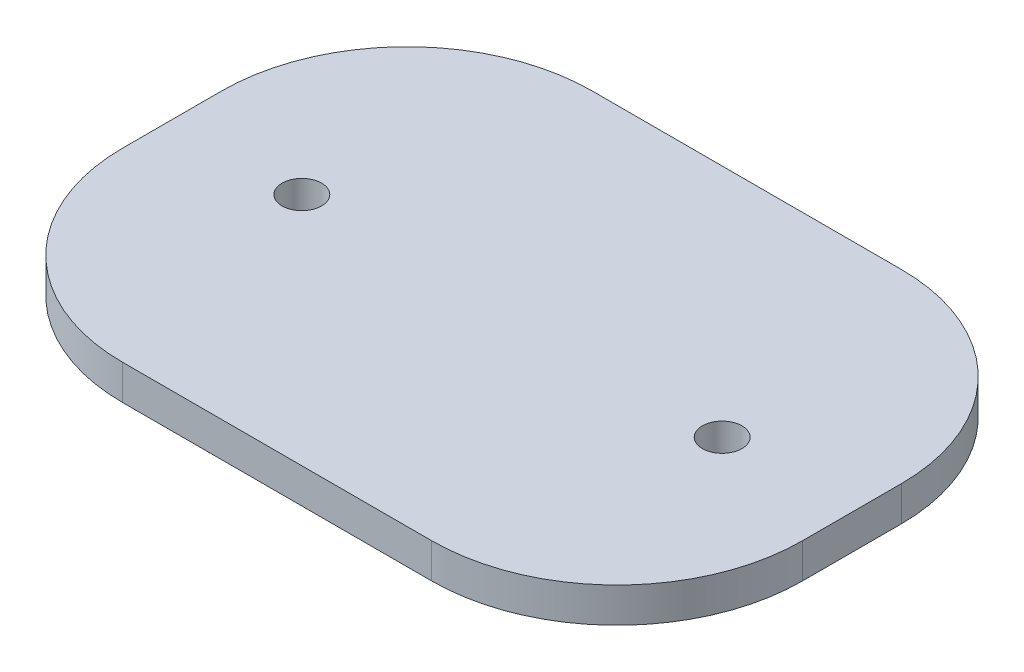
ISO-10303-21;
HEADER;
FILE_DESCRIPTION(('STEP AP214'),'2;1');
FILE_NAME('part.step','',(''),(''),'','','');
FILE_SCHEMA(('AUTOMOTIVE_DESIGN { 1 0 10303 214 1 1 1 1 }'));
ENDSEC;
DATA;
#1=APPLICATION_CONTEXT('core data for automotive mechanical design processes');
#2=APPLICATION_PROTOCOL_DEFINITION('international standard','automotive_design',2000,#1);
#3=PRODUCT_CONTEXT('',#1,'mechanical');
#4=PRODUCT('Part','Part','',(#3));
#5=PRODUCT_RELATED_PRODUCT_CATEGORY('part','',(#4));
#6=PRODUCT_DEFINITION_FORMATION('','',#4);
#7=PRODUCT_DEFINITION_CONTEXT('part definition',#1,'design');
#8=PRODUCT_DEFINITION('design','',#6,#7);
#9=PRODUCT_DEFINITION_SHAPE('','',#8);
#10=(LENGTH_UNIT() NAMED_UNIT(*) SI_UNIT(.MILLI.,.METRE.));
#11=(NAMED_UNIT(*) PLANE_ANGLE_UNIT() SI_UNIT($,.RADIAN.));
#12=(NAMED_UNIT(*) SI_UNIT($,.STERADIAN.) SOLID_ANGLE_UNIT());
#13=UNCERTAINTY_MEASURE_WITH_UNIT(LENGTH_MEASURE(1.E-05),#10,'distance_accuracy_value','');
#14=(GEOMETRIC_REPRESENTATION_CONTEXT(3) GLOBAL_UNCERTAINTY_ASSIGNED_CONTEXT((#13)) GLOBAL_UNIT_ASSIGNED_CONTEXT((#10,
#11,#12)) REPRESENTATION_CONTEXT('',''));
#15=CARTESIAN_POINT('',(0.,0.,0.));
#16=DIRECTION('',(0.,0.,1.));
#17=DIRECTION('',(1.,0.,0.));
#18=AXIS2_PLACEMENT_3D('',#15,#16,#17);
#19=CARTESIAN_POINT('',(-12.5,0.,3.99999999999999));
#20=DIRECTION('',(0.,1.,0.));
#21=DIRECTION('',(0.,0.,1.));
#22=AXIS2_PLACEMENT_3D('',#19,#20,#21);
#23=PLANE('',#22);
#24=CARTESIAN_POINT('',(-17.,0.,0.));
#25=DIRECTION('',(0.,1.,0.));
#26=DIRECTION('',(0.,0.,1.));
#27=AXIS2_PLACEMENT_3D('',#24,#25,#26);
#28=CIRCLE('',#27,1.6);
#29=CARTESIAN_POINT('',(-17.,0.,1.6));
#30=VERTEX_POINT('',#29);
#31=EDGE_CURVE('E353',#30,#30,#28,.T.);
#32=ORIENTED_EDGE('',*,*,#31,.T.);
#33=EDGE_LOOP('',(#32));
#34=FACE_BOUND('',#33,.T.);
#35=CARTESIAN_POINT('',(17.,0.,0.));
#36=DIRECTION('',(0.,1.,0.));
#37=DIRECTION('',(0.,0.,1.));
#38=AXIS2_PLACEMENT_3D('',#35,#36,#37);
#39=CIRCLE('',#38,1.6);
#40=CARTESIAN_POINT('',(17.,0.,1.6));
#41=VERTEX_POINT('',#40);
#42=EDGE_CURVE('E871',#41,#41,#39,.T.);
#43=ORIENTED_EDGE('',*,*,#42,.T.);
#44=EDGE_LOOP('',(#43));
#45=FACE_BOUND('',#44,.T.);
#46=CARTESIAN_POINT('',(-12.5,0.,3.99999999999999));
#47=DIRECTION('',(0.,1.,0.));
#48=DIRECTION('',(0.,0.,1.));
#49=AXIS2_PLACEMENT_3D('',#46,#47,#48);
#50=CIRCLE('',#49,10.);
#51=CARTESIAN_POINT('',(-22.5,0.,3.99999999999992));
#52=VERTEX_POINT('',#51);
#53=CARTESIAN_POINT('',(-12.4999999999999,0.,14.));
#54=VERTEX_POINT('',#53);
#55=EDGE_CURVE('E358',#52,#54,#50,.T.);
#56=ORIENTED_EDGE('',*,*,#55,.F.);
#57=DIRECTION('',(0.,0.,1.));
#58=VECTOR('',#57,1.);
#59=CARTESIAN_POINT('',(-22.5,0.,3.99999999999992));
#60=LINE('',#59,#58);
#61=CARTESIAN_POINT('',(-22.5,0.,-3.99999999999993));
#62=VERTEX_POINT('',#61);
#63=EDGE_CURVE('E471',#62,#52,#60,.T.);
#64=ORIENTED_EDGE('',*,*,#63,.F.);
#65=CARTESIAN_POINT('',(-12.5,0.,-4.00000000000001));
#66=DIRECTION('',(0.,1.,0.));
#67=DIRECTION('',(0.,0.,-1.));
#68=AXIS2_PLACEMENT_3D('',#65,#66,#67);
#69=CIRCLE('',#68,10.);
#70=CARTESIAN_POINT('',(-12.5,0.,-14.));
#71=VERTEX_POINT('',#70);
#72=EDGE_CURVE('E545',#71,#62,#69,.T.);
#73=ORIENTED_EDGE('',*,*,#72,.F.);
#74=DIRECTION('',(-1.,0.,0.));
#75=VECTOR('',#74,1.);
#76=CARTESIAN_POINT('',(-12.4999999999999,0.,-14.));
#77=LINE('',#76,#75);
#78=CARTESIAN_POINT('',(12.4999999999999,0.,-14.));
#79=VERTEX_POINT('',#78);
#80=EDGE_CURVE('E535',#79,#71,#77,.T.);
#81=ORIENTED_EDGE('',*,*,#80,.F.);
#82=CARTESIAN_POINT('',(12.5,0.,-4.));
#83=DIRECTION('',(0.,1.,0.));
#84=DIRECTION('',(0.,0.,1.));
#85=AXIS2_PLACEMENT_3D('',#82,#83,#84);
#86=CIRCLE('',#85,10.);
#87=CARTESIAN_POINT('',(22.5,0.,-3.99999999999993));
#88=VERTEX_POINT('',#87);
#89=EDGE_CURVE('E525',#88,#79,#86,.T.);
#90=ORIENTED_EDGE('',*,*,#89,.F.);
#91=DIRECTION('',(0.,0.,-1.));
#92=VECTOR('',#91,1.);
#93=CARTESIAN_POINT('',(22.5,0.,3.99999999999993));
#94=LINE('',#93,#92);
#95=CARTESIAN_POINT('',(22.5,0.,3.99999999999993));
#96=VERTEX_POINT('',#95);
#97=EDGE_CURVE('E514',#96,#88,#94,.T.);
#98=ORIENTED_EDGE('',*,*,#97,.F.);
#99=CARTESIAN_POINT('',(12.5,0.,4.));
#100=DIRECTION('',(0.,1.,0.));
#101=DIRECTION('',(0.,0.,1.));
#102=AXIS2_PLACEMENT_3D('',#99,#100,#101);
#103=CIRCLE('',#102,10.);
#104=CARTESIAN_POINT('',(12.4999999999999,0.,14.));
#105=VERTEX_POINT('',#104);
#106=EDGE_CURVE('E503',#105,#96,#103,.T.);
#107=ORIENTED_EDGE('',*,*,#106,.F.);
#108=DIRECTION('',(1.,0.,0.));
#109=VECTOR('',#108,1.);
#110=CARTESIAN_POINT('',(-12.4999999999999,0.,14.));
#111=LINE('',#110,#109);
#112=EDGE_CURVE('E363',#54,#105,#111,.T.);
#113=ORIENTED_EDGE('',*,*,#112,.F.);
#114=EDGE_LOOP('',(#56,#64,#73,#81,#90,#98,#107,#113));
#115=FACE_BOUND('',#114,.T.);
#116=ADVANCED_FACE('F237',(#34,#45,#115),#23,.F.);
#117=CARTESIAN_POINT('',(-22.5,0.,-3.99999999793787));
#118=CARTESIAN_POINT('',(-27.5,2.,-3.99999999725475));
#119=CARTESIAN_POINT('',(-22.5,0.,-3.41909728808261));
#120=CARTESIAN_POINT('',(-27.5,2.,-3.22665565237734));
#121=CARTESIAN_POINT('',(-22.5,0.,-2.15693573160333));
#122=CARTESIAN_POINT('',(-27.5,2.,-1.87246851236455));
#123=CARTESIAN_POINT('',(-22.4999999999999,0.,0.));
#124=CARTESIAN_POINT('',(-27.5,2.,0.));
#125=CARTESIAN_POINT('',(-22.5,0.,2.15693573160332));
#126=CARTESIAN_POINT('',(-27.5,2.,1.87246851236454));
#127=CARTESIAN_POINT('',(-22.5,0.,3.4190972880826));
#128=CARTESIAN_POINT('',(-27.5,2.,3.22665565237733));
#129=CARTESIAN_POINT('',(-22.5,0.,4.69738044233488));
#130=CARTESIAN_POINT('',(-27.5,2.,4.92840885772796));
#131=CARTESIAN_POINT('',(-22.355458001131,0.,6.04561976731065));
#132=CARTESIAN_POINT('',(-27.3268396071023,2.,6.83441065921755));
#133=CARTESIAN_POINT('',(-21.7714475420713,0.,7.90598431127842));
#134=CARTESIAN_POINT('',(-26.4822916202665,2.,9.70767416265126));
#135=CARTESIAN_POINT('',(-20.8697424565421,0.,9.58070064986567));
#136=CARTESIAN_POINT('',(-25.0379001290509,2.,12.4263165851559));
#137=CARTESIAN_POINT('',(-19.6805517905211,0.,11.043252891795));
#138=CARTESIAN_POINT('',(-23.0476740072102,2.,14.8143366522482));
#139=CARTESIAN_POINT('',(-18.2340845899858,0.,12.2671251457889));
#140=CARTESIAN_POINT('',(-20.633040050982,2.,16.7254698605989));
#141=CARTESIAN_POINT('',(-16.5491619591087,0.,13.2124423093309));
#142=CARTESIAN_POINT('',(-17.9575512875605,2.,18.0743935723073));
#143=CARTESIAN_POINT('',(-14.6446050020623,0.,13.8393292799044));
#144=CARTESIAN_POINT('',(-15.1897519287645,2.,18.8450121601466));
#145=CARTESIAN_POINT('',(-13.2369733492119,0.,14.));
#146=CARTESIAN_POINT('',(-13.3791611347157,2.,19.));
#147=CARTESIAN_POINT('',(-10.5816164356851,0.,14.));
#148=CARTESIAN_POINT('',(-10.2114935390452,2.,19.));
#149=CARTESIAN_POINT('',(-6.52902380407733,0.,14.));
#150=CARTESIAN_POINT('',(-5.98292490141734,2.,19.));
#151=CARTESIAN_POINT('',(0.,0.,14.));
#152=CARTESIAN_POINT('',(0.,2.,19.));
#153=CARTESIAN_POINT('',(6.52902380407733,0.,14.));
#154=CARTESIAN_POINT('',(5.98292490141724,2.,19.));
#155=CARTESIAN_POINT('',(10.5816164356851,0.,14.));
#156=CARTESIAN_POINT('',(10.2114935390451,2.,19.));
#157=CARTESIAN_POINT('',(13.2369733492118,0.,14.));
#158=CARTESIAN_POINT('',(13.3791611347156,2.,19.));
#159=CARTESIAN_POINT('',(14.6446050020622,0.,13.8393292799044));
#160=CARTESIAN_POINT('',(15.1897519287644,2.,18.8450121601466));
#161=CARTESIAN_POINT('',(16.5491619591087,0.,13.2124423093309));
#162=CARTESIAN_POINT('',(17.9575512875605,2.,18.0743935723074));
#163=CARTESIAN_POINT('',(18.2340845899858,0.,12.2671251457889));
#164=CARTESIAN_POINT('',(20.6330400509819,2.,16.7254698605988));
#165=CARTESIAN_POINT('',(19.6805517905211,0.,11.043252891795));
#166=CARTESIAN_POINT('',(23.0476740072102,2.,14.8143366522483));
#167=CARTESIAN_POINT('',(20.8697424565421,0.,9.58070064986569));
#168=CARTESIAN_POINT('',(25.0379001290509,2.,12.426316585156));
#169=CARTESIAN_POINT('',(21.7714475420713,0.,7.90598431127844));
#170=CARTESIAN_POINT('',(26.4822916202664,2.,9.70767416265135));
#171=CARTESIAN_POINT('',(22.355458001131,0.,6.04561976731066));
#172=CARTESIAN_POINT('',(27.3268396071023,2.,6.83441065921764));
#173=CARTESIAN_POINT('',(22.5,0.,4.69738044233489));
#174=CARTESIAN_POINT('',(27.5,2.,4.92840885772804));
#175=CARTESIAN_POINT('',(22.5,0.,3.41909728808261));
#176=CARTESIAN_POINT('',(27.5,2.,3.2266556523774));
#177=CARTESIAN_POINT('',(22.5,0.,2.15693573160332));
#178=CARTESIAN_POINT('',(27.5,2.,1.87246851236459));
#179=CARTESIAN_POINT('',(22.5,0.,0.));
#180=CARTESIAN_POINT('',(27.5,2.,0.));
#181=CARTESIAN_POINT('',(22.5,0.,-2.15693573160333));
#182=CARTESIAN_POINT('',(27.5,2.,-1.87246851236453));
#183=CARTESIAN_POINT('',(22.5,0.,-3.41909728808261));
#184=CARTESIAN_POINT('',(27.5,2.,-3.22665565237733));
#185=CARTESIAN_POINT('',(22.5,0.,-4.69738044233489));
#186=CARTESIAN_POINT('',(27.5,2.,-4.92840885772798));
#187=CARTESIAN_POINT('',(22.355458001131,0.,-6.04561976731069));
#188=CARTESIAN_POINT('',(27.3268396071023,2.,-6.83441065921757));
#189=CARTESIAN_POINT('',(21.7714475420713,0.,-7.90598431127842));
#190=CARTESIAN_POINT('',(26.4822916202664,2.,-9.70767416265131));
#191=CARTESIAN_POINT('',(20.8697424565421,0.,-9.58070064986569));
#192=CARTESIAN_POINT('',(25.037900129051,2.00000000000001,-12.426316585156));
#193=CARTESIAN_POINT('',(19.6805517905211,0.,-11.043252891795));
#194=CARTESIAN_POINT('',(23.0476740072101,1.99999999999999,-14.8143366522482));
#195=CARTESIAN_POINT('',(18.2340845899858,0.,-12.2671251457889));
#196=CARTESIAN_POINT('',(20.633040050982,2.,-16.7254698605989));
#197=CARTESIAN_POINT('',(16.5491619591087,0.,-13.2124423093309));
#198=CARTESIAN_POINT('',(17.9575512875604,2.,-18.0743935723074));
#199=CARTESIAN_POINT('',(14.6446050020623,0.,-13.8393292799045));
#200=CARTESIAN_POINT('',(15.1897519287644,2.,-18.8450121601466));
#201=CARTESIAN_POINT('',(13.2369733492119,0.,-14.));
#202=CARTESIAN_POINT('',(13.3791611347156,2.,-19.));
#203=CARTESIAN_POINT('',(10.5816164356851,0.,-14.));
#204=CARTESIAN_POINT('',(10.2114935390451,2.,-19.));
#205=CARTESIAN_POINT('',(6.52902380407732,0.,-14.));
#206=CARTESIAN_POINT('',(5.98292490141725,2.,-19.));
#207=CARTESIAN_POINT('',(0.,0.,-14.));
#208=CARTESIAN_POINT('',(0.,2.,-19.));
#209=CARTESIAN_POINT('',(-6.52902380407739,0.,-14.));
#210=CARTESIAN_POINT('',(-5.98292490141727,2.,-19.));
#211=CARTESIAN_POINT('',(-10.5816164356852,0.,-14.));
#212=CARTESIAN_POINT('',(-10.2114935390451,2.,-19.));
#213=CARTESIAN_POINT('',(-13.2369733492119,0.,-14.));
#214=CARTESIAN_POINT('',(-13.3791611347156,2.,-19.));
#215=CARTESIAN_POINT('',(-14.6446050020623,0.,-13.8393292799044));
#216=CARTESIAN_POINT('',(-15.1897519287644,2.,-18.8450121601467));
#217=CARTESIAN_POINT('',(-16.5491619591087,0.,-13.2124423093309));
#218=CARTESIAN_POINT('',(-17.9575512875605,2.,-18.0743935723074));
#219=CARTESIAN_POINT('',(-18.2340845899858,0.,-12.2671251457889));
#220=CARTESIAN_POINT('',(-20.6330400509819,2.,-16.7254698605989));
#221=CARTESIAN_POINT('',(-19.6805517905211,0.,-11.043252891795));
#222=CARTESIAN_POINT('',(-23.0476740072103,1.99999999999999,-14.8143366522483));
#223=CARTESIAN_POINT('',(-20.8697424565421,0.,-9.58070064986569));
#224=CARTESIAN_POINT('',(-25.0379001290509,2.00000000000001,-12.426316585156));
#225=CARTESIAN_POINT('',(-21.7714475420713,0.,-7.90598431127844));
#226=CARTESIAN_POINT('',(-26.4822916202665,1.99999999999999,-9.70767416265128));
#227=CARTESIAN_POINT('',(-22.355458001131,0.,-6.04561976731064));
#228=CARTESIAN_POINT('',(-27.3268396071023,2.00000000000001,-6.83441065921759));
#229=CARTESIAN_POINT('',(-22.5,0.,-4.69738044233489));
#230=CARTESIAN_POINT('',(-27.5,2.,-4.92840885772798));
#231=CARTESIAN_POINT('',(-22.5,0.,-3.99999999793787));
#232=CARTESIAN_POINT('',(-27.5,2.,-3.99999999725475));
#233=B_SPLINE_SURFACE_WITH_KNOTS('',3,1,((#117,#118),(#119,#120),(#121,#122),(#123,#124),(#125,
#126),(#127,#128),(#129,#130),(#131,#132),(#133,#134),(#135,#136),(#137,#138),(#139,#140),(#141,
#142),(#143,#144),(#145,#146),(#147,#148),(#149,#150),(#151,#152),(#153,#154),(#155,#156),(#157,
#158),(#159,#160),(#161,#162),(#163,#164),(#165,#166),(#167,#168),(#169,#170),(#171,#172),(#173,
#174),(#175,#176),(#177,#178),(#179,#180),(#181,#182),(#183,#184),(#185,#186),(#187,#188),(#189,
#190),(#191,#192),(#193,#194),(#195,#196),(#197,#198),(#199,#200),(#201,#202),(#203,#204),(#205,
#206),(#207,#208),(#209,#210),(#211,#212),(#213,#214),(#215,#216),(#217,#218),(#219,#220),(#221,
#222),(#223,#224),(#225,#226),(#227,#228),(#229,#230),(#231,#232)),.UNSPECIFIED.,.T.,.F.,.F.,(4,
1,1,1,2,1,1,1,1,1,1,1,2,1,1,1,2,1,1,1,1,1,1,1,2,1,1,1,2,1,1,1,1,1,1,1,2,1,1,1,2,1,1,1,1,1,1,1,
4),(2,2),(0.,0.0140023916236612,0.0280047832473224,0.0420071748709836,0.0560095664946448,
0.072819600132744,0.0896296337708432,0.106439667408942,0.123249701047042,0.140059734685141,
0.15686976832324,0.173679801961339,0.190489835599438,0.23424730942338,0.278004783247322,
0.321762257071264,0.365519730895206,0.382329764533305,0.399139798171404,0.415949831809504,
0.432759865447603,0.449569899085702,0.466379932723801,0.4831899663619,0.5,0.514002391623661,
0.528004783247322,0.542007174870983,0.556009566494645,0.572819600132744,0.589629633770843,
0.606439667408942,0.623249701047042,0.640059734685141,0.65686976832324,0.673679801961339,
0.690489835599439,0.734247309423381,0.778004783247322,0.821762257071264,0.865519730895206,
0.882329764533305,0.899139798171405,0.915949831809504,0.932759865447603,0.949569899085702,
0.966379932723802,0.983189966361901,1.),(0.,1.),.UNSPECIFIED.);
#234=CARTESIAN_POINT('',(12.5,2.,-4.));
#235=DIRECTION('',(0.,1.,0.));
#236=DIRECTION('',(0.,0.,1.));
#237=AXIS2_PLACEMENT_3D('',#234,#235,#236);
#238=CIRCLE('',#237,15.);
#239=CARTESIAN_POINT('',(27.5,2.,-4.00000000001576));
#240=VERTEX_POINT('',#239);
#241=CARTESIAN_POINT('',(12.4999999999999,2.,-19.));
#242=VERTEX_POINT('',#241);
#243=EDGE_CURVE('E251',#240,#242,#238,.T.);
#244=DIRECTION('',(0.,0.,-1.));
#245=VECTOR('',#244,1.);
#246=CARTESIAN_POINT('',(27.5,2.,4.));
#247=LINE('',#246,#245);
#248=CARTESIAN_POINT('',(27.5,2.,3.99999999972068));
#249=VERTEX_POINT('',#248);
#250=EDGE_CURVE('E612',#249,#240,#247,.T.);
#251=CARTESIAN_POINT('',(12.5,2.,4.));
#252=DIRECTION('',(0.,1.,0.));
#253=DIRECTION('',(0.,0.,1.));
#254=AXIS2_PLACEMENT_3D('',#251,#252,#253);
#255=CIRCLE('',#254,15.);
#256=CARTESIAN_POINT('',(12.5000000000691,2.,19.));
#257=VERTEX_POINT('',#256);
#258=EDGE_CURVE('E602',#257,#249,#255,.T.);
#259=DIRECTION('',(1.,0.,0.));
#260=VECTOR('',#259,1.);
#261=CARTESIAN_POINT('',(-12.4999999999999,2.,19.));
#262=LINE('',#261,#260);
#263=CARTESIAN_POINT('',(-12.5000000000478,2.,19.));
#264=VERTEX_POINT('',#263);
#265=EDGE_CURVE('E591',#264,#257,#262,.T.);
#266=CARTESIAN_POINT('',(-12.5,2.,3.99999999999999));
#267=DIRECTION('',(0.,1.,0.));
#268=DIRECTION('',(0.,0.,1.));
#269=AXIS2_PLACEMENT_3D('',#266,#267,#268);
#270=CIRCLE('',#269,15.);
#271=CARTESIAN_POINT('',(-27.5,2.,4.00000000001585));
#272=VERTEX_POINT('',#271);
#273=EDGE_CURVE('E377',#272,#264,#270,.T.);
#274=DIRECTION('',(0.,0.,1.));
#275=VECTOR('',#274,1.);
#276=CARTESIAN_POINT('',(-27.5,2.,-3.99999999999993));
#277=LINE('',#276,#275);
#278=CARTESIAN_POINT('',(-27.5,2.,-3.99999999972044));
#279=VERTEX_POINT('',#278);
#280=EDGE_CURVE('E405',#279,#272,#277,.T.);
#281=CARTESIAN_POINT('',(-12.5,2.,-4.00000000000001));
#282=DIRECTION('',(0.,1.,0.));
#283=DIRECTION('',(0.,0.,1.));
#284=AXIS2_PLACEMENT_3D('',#281,#282,#283);
#285=CIRCLE('',#284,15.);
#286=CARTESIAN_POINT('',(-12.4999999999999,2.,-19.));
#287=VERTEX_POINT('',#286);
#288=EDGE_CURVE('E244',#287,#279,#285,.T.);
#289=DIRECTION('',(-1.,0.,0.));
#290=VECTOR('',#289,1.);
#291=CARTESIAN_POINT('',(12.4999999999999,2.,-19.));
#292=LINE('',#291,#290);
#293=EDGE_CURVE('E12',#242,#287,#292,.T.);
#294=CARTESIAN_POINT('',(0.,0.,-14.));
#295=CARTESIAN_POINT('',(0.,2.,-19.));
#296=CARTESIAN_POINT('',(-2.17634126802581,0.,-14.));
#297=CARTESIAN_POINT('',(-1.99430830047243,2.,-19.));
#298=CARTESIAN_POINT('',(-6.52902380407739,0.,-14.));
#299=CARTESIAN_POINT('',(-5.98292490141727,2.,-19.));
#300=CARTESIAN_POINT('',(-10.5816164356852,0.,-14.));
#301=CARTESIAN_POINT('',(-10.2114935390451,2.,-19.));
#302=CARTESIAN_POINT('',(-13.2369733492119,0.,-14.));
#303=CARTESIAN_POINT('',(-13.3791611347156,2.,-19.));
#304=CARTESIAN_POINT('',(-14.6446050020623,0.,-13.8393292799044));
#305=CARTESIAN_POINT('',(-15.1897519287644,2.,-18.8450121601467));
#306=CARTESIAN_POINT('',(-16.5491619591087,0.,-13.2124423093309));
#307=CARTESIAN_POINT('',(-17.9575512875605,2.,-18.0743935723074));
#308=CARTESIAN_POINT('',(-18.2340845899858,0.,-12.2671251457889));
#309=CARTESIAN_POINT('',(-20.6330400509819,2.,-16.7254698605989));
#310=CARTESIAN_POINT('',(-19.6805517905211,0.,-11.043252891795));
#311=CARTESIAN_POINT('',(-23.0476740072103,1.99999999999999,-14.8143366522483));
#312=CARTESIAN_POINT('',(-20.8697424565421,0.,-9.58070064986569));
#313=CARTESIAN_POINT('',(-25.0379001290509,2.00000000000001,-12.426316585156));
#314=CARTESIAN_POINT('',(-21.7714475420713,0.,-7.90598431127844));
#315=CARTESIAN_POINT('',(-26.4822916202665,1.99999999999999,-9.70767416265128));
#316=CARTESIAN_POINT('',(-22.355458001131,0.,-6.04561976731064));
#317=CARTESIAN_POINT('',(-27.3268396071023,2.00000000000001,-6.83441065921759));
#318=CARTESIAN_POINT('',(-22.5,0.,-4.69738044233489));
#319=CARTESIAN_POINT('',(-27.5,2.,-4.92840885772798));
#320=CARTESIAN_POINT('',(-22.5,0.,-3.41909728808261));
#321=CARTESIAN_POINT('',(-27.5,2.,-3.22665565237734));
#322=CARTESIAN_POINT('',(-22.5,0.,-2.15693573160333));
#323=CARTESIAN_POINT('',(-27.5,2.,-1.87246851236455));
#324=CARTESIAN_POINT('',(-22.4999999999999,0.,0.));
#325=CARTESIAN_POINT('',(-27.5,2.,0.));
#326=CARTESIAN_POINT('',(-22.5,0.,2.15693573160332));
#327=CARTESIAN_POINT('',(-27.5,2.,1.87246851236454));
#328=CARTESIAN_POINT('',(-22.5,0.,3.4190972880826));
#329=CARTESIAN_POINT('',(-27.5,2.,3.22665565237733));
#330=CARTESIAN_POINT('',(-22.5,0.,4.69738044233488));
#331=CARTESIAN_POINT('',(-27.5,2.,4.92840885772796));
#332=CARTESIAN_POINT('',(-22.355458001131,0.,6.04561976731065));
#333=CARTESIAN_POINT('',(-27.3268396071023,2.,6.83441065921755));
#334=CARTESIAN_POINT('',(-21.7714475420713,0.,7.90598431127842));
#335=CARTESIAN_POINT('',(-26.4822916202665,2.,9.70767416265126));
#336=CARTESIAN_POINT('',(-20.8697424565421,0.,9.58070064986567));
#337=CARTESIAN_POINT('',(-25.0379001290509,2.,12.4263165851559));
#338=CARTESIAN_POINT('',(-19.6805517905211,0.,11.043252891795));
#339=CARTESIAN_POINT('',(-23.0476740072102,2.,14.8143366522482));
#340=CARTESIAN_POINT('',(-18.2340845899858,0.,12.2671251457889));
#341=CARTESIAN_POINT('',(-20.633040050982,2.,16.7254698605989));
#342=CARTESIAN_POINT('',(-16.5491619591087,0.,13.2124423093309));
#343=CARTESIAN_POINT('',(-17.9575512875605,2.,18.0743935723073));
#344=CARTESIAN_POINT('',(-14.6446050020623,0.,13.8393292799044));
#345=CARTESIAN_POINT('',(-15.1897519287645,2.,18.8450121601466));
#346=CARTESIAN_POINT('',(-13.2369733492119,0.,14.));
#347=CARTESIAN_POINT('',(-13.3791611347157,2.,19.));
#348=CARTESIAN_POINT('',(-10.5816164356851,0.,14.));
#349=CARTESIAN_POINT('',(-10.2114935390452,2.,19.));
#350=CARTESIAN_POINT('',(-6.52902380407733,0.,14.));
#351=CARTESIAN_POINT('',(-5.98292490141734,2.,19.));
#352=CARTESIAN_POINT('',(0.,0.,14.));
#353=CARTESIAN_POINT('',(0.,2.,19.));
#354=CARTESIAN_POINT('',(6.52902380407733,0.,14.));
#355=CARTESIAN_POINT('',(5.98292490141724,2.,19.));
#356=CARTESIAN_POINT('',(10.5816164356851,0.,14.));
#357=CARTESIAN_POINT('',(10.2114935390451,2.,19.));
#358=CARTESIAN_POINT('',(13.2369733492118,0.,14.));
#359=CARTESIAN_POINT('',(13.3791611347156,2.,19.));
#360=CARTESIAN_POINT('',(14.6446050020622,0.,13.8393292799044));
#361=CARTESIAN_POINT('',(15.1897519287644,2.,18.8450121601466));
#362=CARTESIAN_POINT('',(16.5491619591087,0.,13.2124423093309));
#363=CARTESIAN_POINT('',(17.9575512875605,2.,18.0743935723074));
#364=CARTESIAN_POINT('',(18.2340845899858,0.,12.2671251457889));
#365=CARTESIAN_POINT('',(20.6330400509819,2.,16.7254698605988));
#366=CARTESIAN_POINT('',(19.6805517905211,0.,11.043252891795));
#367=CARTESIAN_POINT('',(23.0476740072102,2.,14.8143366522483));
#368=CARTESIAN_POINT('',(20.8697424565421,0.,9.58070064986569));
#369=CARTESIAN_POINT('',(25.0379001290509,2.,12.426316585156));
#370=CARTESIAN_POINT('',(21.7714475420713,0.,7.90598431127844));
#371=CARTESIAN_POINT('',(26.4822916202664,2.,9.70767416265135));
#372=CARTESIAN_POINT('',(22.355458001131,0.,6.04561976731066));
#373=CARTESIAN_POINT('',(27.3268396071023,2.,6.83441065921764));
#374=CARTESIAN_POINT('',(22.5,0.,4.69738044233489));
#375=CARTESIAN_POINT('',(27.5,2.,4.92840885772804));
#376=CARTESIAN_POINT('',(22.5,0.,3.41909728808261));
#377=CARTESIAN_POINT('',(27.5,2.,3.2266556523774));
#378=CARTESIAN_POINT('',(22.5,0.,2.15693573160332));
#379=CARTESIAN_POINT('',(27.5,2.,1.87246851236459));
#380=CARTESIAN_POINT('',(22.5,0.,0.));
#381=CARTESIAN_POINT('',(27.5,2.,0.));
#382=CARTESIAN_POINT('',(22.5,0.,-2.15693573160333));
#383=CARTESIAN_POINT('',(27.5,2.,-1.87246851236453));
#384=CARTESIAN_POINT('',(22.5,0.,-3.41909728808261));
#385=CARTESIAN_POINT('',(27.5,2.,-3.22665565237733));
#386=CARTESIAN_POINT('',(22.5,0.,-4.69738044233489));
#387=CARTESIAN_POINT('',(27.5,2.,-4.92840885772798));
#388=CARTESIAN_POINT('',(22.355458001131,0.,-6.04561976731069));
#389=CARTESIAN_POINT('',(27.3268396071023,2.,-6.83441065921757));
#390=CARTESIAN_POINT('',(21.7714475420713,0.,-7.90598431127842));
#391=CARTESIAN_POINT('',(26.4822916202664,2.,-9.70767416265131));
#392=CARTESIAN_POINT('',(20.8697424565421,0.,-9.58070064986569));
#393=CARTESIAN_POINT('',(25.037900129051,2.00000000000001,-12.426316585156));
#394=CARTESIAN_POINT('',(19.6805517905211,0.,-11.043252891795));
#395=CARTESIAN_POINT('',(23.0476740072101,1.99999999999999,-14.8143366522482));
#396=CARTESIAN_POINT('',(18.2340845899858,0.,-12.2671251457889));
#397=CARTESIAN_POINT('',(20.633040050982,2.,-16.7254698605989));
#398=CARTESIAN_POINT('',(16.5491619591087,0.,-13.2124423093309));
#399=CARTESIAN_POINT('',(17.9575512875604,2.,-18.0743935723074));
#400=CARTESIAN_POINT('',(14.6446050020623,0.,-13.8393292799045));
#401=CARTESIAN_POINT('',(15.1897519287644,2.,-18.8450121601466));
#402=CARTESIAN_POINT('',(13.2369733492119,0.,-14.));
#403=CARTESIAN_POINT('',(13.3791611347156,2.,-19.));
#404=CARTESIAN_POINT('',(10.5816164356851,0.,-14.));
#405=CARTESIAN_POINT('',(10.2114935390451,2.,-19.));
#406=CARTESIAN_POINT('',(6.52902380407732,0.,-14.));
#407=CARTESIAN_POINT('',(5.98292490141725,2.,-19.));
#408=CARTESIAN_POINT('',(2.17634126802575,0.,-14.));
#409=CARTESIAN_POINT('',(1.99430830047241,2.,-19.));
#410=CARTESIAN_POINT('',(0.,0.,-14.));
#411=CARTESIAN_POINT('',(0.,2.,-19.));
#412=B_SPLINE_SURFACE_WITH_KNOTS('',3,1,((#294,#295),(#296,#297),(#298,#299),(#300,#301),(#302,
#303),(#304,#305),(#306,#307),(#308,#309),(#310,#311),(#312,#313),(#314,#315),(#316,#317),(#318,
#319),(#320,#321),(#322,#323),(#324,#325),(#326,#327),(#328,#329),(#330,#331),(#332,#333),(#334,
#335),(#336,#337),(#338,#339),(#340,#341),(#342,#343),(#344,#345),(#346,#347),(#348,#349),(#350,
#351),(#352,#353),(#354,#355),(#356,#357),(#358,#359),(#360,#361),(#362,#363),(#364,#365),(#366,
#367),(#368,#369),(#370,#371),(#372,#373),(#374,#375),(#376,#377),(#378,#379),(#380,#381),(#382,
#383),(#384,#385),(#386,#387),(#388,#389),(#390,#391),(#392,#393),(#394,#395),(#396,#397),(#398,
#399),(#400,#401),(#402,#403),(#404,#405),(#406,#407),(#408,#409),(#410,#411)),.UNSPECIFIED.,
.T.,.F.,.F.,(4,1,2,1,1,1,1,1,1,1,2,1,1,1,2,1,1,1,1,1,1,1,2,1,1,1,2,1,1,1,1,1,1,1,2,1,1,1,2,1,1,
1,1,1,1,1,2,1,4),(2,2),(0.778004783247322,0.821762257071264,0.865519730895206,0.882329764533305,
0.899139798171405,0.915949831809504,0.932759865447603,0.949569899085702,0.966379932723802,
0.983189966361901,1.,1.01400239162366,1.02800478324732,1.04200717487098,1.05600956649464,
1.07281960013274,1.08962963377084,1.10643966740894,1.12324970104704,1.14005973468514,
1.15686976832324,1.17367980196134,1.19048983559944,1.23424730942338,1.27800478324732,
1.32176225707126,1.36551973089521,1.38232976453331,1.3991397981714,1.4159498318095,
1.4327598654476,1.4495698990857,1.4663799327238,1.4831899663619,1.5,1.51400239162366,
1.52800478324732,1.54200717487098,1.55600956649464,1.57281960013274,1.58962963377084,
1.60643966740894,1.62324970104704,1.64005973468514,1.65686976832324,1.67367980196134,
1.69048983559944,1.73424730942338,1.77800478324732),(0.,1.),.UNSPECIFIED.);
#413=ORIENTED_EDGE('',*,*,#63,.T.);
#414=ORIENTED_EDGE('',*,*,#55,.T.);
#415=ORIENTED_EDGE('',*,*,#112,.T.);
#416=ORIENTED_EDGE('',*,*,#106,.T.);
#417=ORIENTED_EDGE('',*,*,#97,.T.);
#418=ORIENTED_EDGE('',*,*,#89,.T.);
#419=ORIENTED_EDGE('',*,*,#80,.T.);
#420=ORIENTED_EDGE('',*,*,#72,.T.);
#421=EDGE_LOOP('',(#413,#414,#415,#416,#417,#418,#419,#420));
#422=FACE_BOUND('',#421,.T.);
#423=ORIENTED_EDGE('',*,*,#243,.F.);
#424=ORIENTED_EDGE('',*,*,#250,.F.);
#425=ORIENTED_EDGE('',*,*,#258,.F.);
#426=ORIENTED_EDGE('',*,*,#265,.F.);
#427=ORIENTED_EDGE('',*,*,#273,.F.);
#428=ORIENTED_EDGE('',*,*,#280,.F.);
#429=ORIENTED_EDGE('',*,*,#288,.F.);
#430=ORIENTED_EDGE('',*,*,#293,.F.);
#431=EDGE_LOOP('',(#423,#424,#425,#426,#427,#428,#429,#430));
#432=FACE_BOUND('',#431,.T.);
#433=ADVANCED_FACE('F239',(#422,#432),#412,.T.);
#434=CARTESIAN_POINT('',(-12.5,4.82,-4.00000000000001));
#435=DIRECTION('',(0.,-1.,0.));
#436=DIRECTION('',(0.,0.,-1.));
#437=AXIS2_PLACEMENT_3D('',#434,#435,#436);
#438=CYLINDRICAL_SURFACE('',#437,15.);
#439=ORIENTED_EDGE('',*,*,#288,.T.);
#440=DIRECTION('',(0.,-1.,0.));
#441=VECTOR('',#440,1.);
#442=CARTESIAN_POINT('',(-27.5,4.82,-3.99999999972045));
#443=LINE('',#442,#441);
#444=CARTESIAN_POINT('',(-27.5,4.82,-3.99999999972045));
#445=VERTEX_POINT('',#444);
#446=EDGE_CURVE('E335',#445,#279,#443,.T.);
#447=ORIENTED_EDGE('',*,*,#446,.F.);
#448=CARTESIAN_POINT('',(-12.5,4.82,-4.00000000000001));
#449=DIRECTION('',(0.,1.,0.));
#450=DIRECTION('',(0.,0.,1.));
#451=AXIS2_PLACEMENT_3D('',#448,#449,#450);
#452=CIRCLE('',#451,15.);
#453=CARTESIAN_POINT('',(-12.4999999999999,4.82,-19.));
#454=VERTEX_POINT('',#453);
#455=EDGE_CURVE('E343',#454,#445,#452,.T.);
#456=ORIENTED_EDGE('',*,*,#455,.F.);
#457=DIRECTION('',(0.,-1.,0.));
#458=VECTOR('',#457,1.);
#459=CARTESIAN_POINT('',(-12.4999999999999,4.82,-19.));
#460=LINE('',#459,#458);
#461=EDGE_CURVE('E465',#454,#287,#460,.T.);
#462=ORIENTED_EDGE('',*,*,#461,.T.);
#463=EDGE_LOOP('',(#439,#447,#456,#462));
#464=FACE_BOUND('',#463,.T.);
#465=ADVANCED_FACE('F355',(#464),#438,.T.);
#466=CARTESIAN_POINT('',(-27.5,4.82,-3.99999999972045));
#467=DIRECTION('',(1.,0.,0.));
#468=DIRECTION('',(0.,0.,-1.));
#469=AXIS2_PLACEMENT_3D('',#466,#467,#468);
#470=PLANE('',#469);
#471=ORIENTED_EDGE('',*,*,#280,.T.);
#472=DIRECTION('',(0.,-1.,0.));
#473=VECTOR('',#472,1.);
#474=CARTESIAN_POINT('',(-27.5,4.82,4.00000000001585));
#475=LINE('',#474,#473);
#476=CARTESIAN_POINT('',(-27.5,4.82,4.00000000001585));
#477=VERTEX_POINT('',#476);
#478=EDGE_CURVE('E338',#477,#272,#475,.T.);
#479=ORIENTED_EDGE('',*,*,#478,.F.);
#480=DIRECTION('',(0.,0.,1.));
#481=VECTOR('',#480,1.);
#482=CARTESIAN_POINT('',(-27.5,4.82,-3.99999999972045));
#483=LINE('',#482,#481);
#484=EDGE_CURVE('E330',#445,#477,#483,.T.);
#485=ORIENTED_EDGE('',*,*,#484,.F.);
#486=ORIENTED_EDGE('',*,*,#446,.T.);
#487=EDGE_LOOP('',(#471,#479,#485,#486));
#488=FACE_BOUND('',#487,.T.);
#489=ADVANCED_FACE('F333',(#488),#470,.F.);
#490=CARTESIAN_POINT('',(-12.5,4.82,3.99999999999999));
#491=DIRECTION('',(0.,-1.,0.));
#492=DIRECTION('',(0.,0.,-1.));
#493=AXIS2_PLACEMENT_3D('',#490,#491,#492);
#494=CYLINDRICAL_SURFACE('',#493,15.);
#495=ORIENTED_EDGE('',*,*,#273,.T.);
#496=DIRECTION('',(0.,-1.,0.));
#497=VECTOR('',#496,1.);
#498=CARTESIAN_POINT('',(-12.5000000000478,4.82,19.));
#499=LINE('',#498,#497);
#500=CARTESIAN_POINT('',(-12.5000000000478,4.82,19.));
#501=VERTEX_POINT('',#500);
#502=EDGE_CURVE('E365',#501,#264,#499,.T.);
#503=ORIENTED_EDGE('',*,*,#502,.F.);
#504=CARTESIAN_POINT('',(-12.5,4.82,3.99999999999999));
#505=DIRECTION('',(0.,1.,0.));
#506=DIRECTION('',(0.,0.,1.));
#507=AXIS2_PLACEMENT_3D('',#504,#505,#506);
#508=CIRCLE('',#507,15.);
#509=EDGE_CURVE('E342',#477,#501,#508,.T.);
#510=ORIENTED_EDGE('',*,*,#509,.F.);
#511=ORIENTED_EDGE('',*,*,#478,.T.);
#512=EDGE_LOOP('',(#495,#503,#510,#511));
#513=FACE_BOUND('',#512,.T.);
#514=ADVANCED_FACE('F383',(#513),#494,.T.);
#515=CARTESIAN_POINT('',(-12.5000000000478,4.82,19.));
#516=DIRECTION('',(0.,0.,-1.));
#517=DIRECTION('',(-1.,0.,0.));
#518=AXIS2_PLACEMENT_3D('',#515,#516,#517);
#519=PLANE('',#518);
#520=ORIENTED_EDGE('',*,*,#265,.T.);
#521=DIRECTION('',(0.,-1.,0.));
#522=VECTOR('',#521,1.);
#523=CARTESIAN_POINT('',(12.5000000000691,4.82,19.));
#524=LINE('',#523,#522);
#525=CARTESIAN_POINT('',(12.5000000000691,4.82,19.));
#526=VERTEX_POINT('',#525);
#527=EDGE_CURVE('E744',#526,#257,#524,.T.);
#528=ORIENTED_EDGE('',*,*,#527,.F.);
#529=DIRECTION('',(1.,0.,0.));
#530=VECTOR('',#529,1.);
#531=CARTESIAN_POINT('',(-12.5000000000478,4.82,19.));
#532=LINE('',#531,#530);
#533=EDGE_CURVE('E880',#501,#526,#532,.T.);
#534=ORIENTED_EDGE('',*,*,#533,.F.);
#535=ORIENTED_EDGE('',*,*,#502,.T.);
#536=EDGE_LOOP('',(#520,#528,#534,#535));
#537=FACE_BOUND('',#536,.T.);
#538=ADVANCED_FACE('F393',(#537),#519,.F.);
#539=CARTESIAN_POINT('',(12.5,4.82,4.));
#540=DIRECTION('',(0.,-1.,0.));
#541=DIRECTION('',(0.,0.,-1.));
#542=AXIS2_PLACEMENT_3D('',#539,#540,#541);
#543=CYLINDRICAL_SURFACE('',#542,15.);
#544=ORIENTED_EDGE('',*,*,#258,.T.);
#545=DIRECTION('',(0.,-1.,0.));
#546=VECTOR('',#545,1.);
#547=CARTESIAN_POINT('',(27.5,4.82,3.99999999972067));
#548=LINE('',#547,#546);
#549=CARTESIAN_POINT('',(27.5,4.82,3.99999999972067));
#550=VERTEX_POINT('',#549);
#551=EDGE_CURVE('E459',#550,#249,#548,.T.);
#552=ORIENTED_EDGE('',*,*,#551,.F.);
#553=CARTESIAN_POINT('',(12.5,4.82,4.));
#554=DIRECTION('',(0.,1.,0.));
#555=DIRECTION('',(0.,0.,1.));
#556=AXIS2_PLACEMENT_3D('',#553,#554,#555);
#557=CIRCLE('',#556,15.);
#558=EDGE_CURVE('E751',#526,#550,#557,.T.);
#559=ORIENTED_EDGE('',*,*,#558,.F.);
#560=ORIENTED_EDGE('',*,*,#527,.T.);
#561=EDGE_LOOP('',(#544,#552,#559,#560));
#562=FACE_BOUND('',#561,.T.);
#563=ADVANCED_FACE('F747',(#562),#543,.T.);
#564=CARTESIAN_POINT('',(27.5,4.82,3.99999999972067));
#565=DIRECTION('',(-1.,0.,0.));
#566=DIRECTION('',(0.,0.,1.));
#567=AXIS2_PLACEMENT_3D('',#564,#565,#566);
#568=PLANE('',#567);
#569=ORIENTED_EDGE('',*,*,#250,.T.);
#570=DIRECTION('',(0.,-1.,0.));
#571=VECTOR('',#570,1.);
#572=CARTESIAN_POINT('',(27.5,4.82,-4.00000000001577));
#573=LINE('',#572,#571);
#574=CARTESIAN_POINT('',(27.5,4.82,-4.00000000001577));
#575=VERTEX_POINT('',#574);
#576=EDGE_CURVE('E450',#575,#240,#573,.T.);
#577=ORIENTED_EDGE('',*,*,#576,.F.);
#578=DIRECTION('',(0.,0.,-1.));
#579=VECTOR('',#578,1.);
#580=CARTESIAN_POINT('',(27.5,4.82,3.99999999972067));
#581=LINE('',#580,#579);
#582=EDGE_CURVE('E885',#550,#575,#581,.T.);
#583=ORIENTED_EDGE('',*,*,#582,.F.);
#584=ORIENTED_EDGE('',*,*,#551,.T.);
#585=EDGE_LOOP('',(#569,#577,#583,#584));
#586=FACE_BOUND('',#585,.T.);
#587=ADVANCED_FACE('F441',(#586),#568,.F.);
#588=CARTESIAN_POINT('',(12.5,4.82,-4.));
#589=DIRECTION('',(0.,-1.,0.));
#590=DIRECTION('',(0.,0.,-1.));
#591=AXIS2_PLACEMENT_3D('',#588,#589,#590);
#592=CYLINDRICAL_SURFACE('',#591,15.);
#593=ORIENTED_EDGE('',*,*,#243,.T.);
#594=DIRECTION('',(0.,-1.,0.));
#595=VECTOR('',#594,1.);
#596=CARTESIAN_POINT('',(12.4999999999999,4.82,-19.));
#597=LINE('',#596,#595);
#598=CARTESIAN_POINT('',(12.4999999999999,4.82,-19.));
#599=VERTEX_POINT('',#598);
#600=EDGE_CURVE('E460',#599,#242,#597,.T.);
#601=ORIENTED_EDGE('',*,*,#600,.F.);
#602=CARTESIAN_POINT('',(12.5,4.82,-4.));
#603=DIRECTION('',(0.,1.,0.));
#604=DIRECTION('',(0.,0.,1.));
#605=AXIS2_PLACEMENT_3D('',#602,#603,#604);
#606=CIRCLE('',#605,15.);
#607=EDGE_CURVE('E888',#575,#599,#606,.T.);
#608=ORIENTED_EDGE('',*,*,#607,.F.);
#609=ORIENTED_EDGE('',*,*,#576,.T.);
#610=EDGE_LOOP('',(#593,#601,#608,#609));
#611=FACE_BOUND('',#610,.T.);
#612=ADVANCED_FACE('F436',(#611),#592,.T.);
#613=CARTESIAN_POINT('',(12.4999999999999,4.82,-19.));
#614=DIRECTION('',(0.,0.,1.));
#615=DIRECTION('',(1.,0.,0.));
#616=AXIS2_PLACEMENT_3D('',#613,#614,#615);
#617=PLANE('',#616);
#618=ORIENTED_EDGE('',*,*,#293,.T.);
#619=ORIENTED_EDGE('',*,*,#461,.F.);
#620=DIRECTION('',(-1.,0.,0.));
#621=VECTOR('',#620,1.);
#622=CARTESIAN_POINT('',(12.4999999999999,4.82,-19.));
#623=LINE('',#622,#621);
#624=EDGE_CURVE('E348',#599,#454,#623,.T.);
#625=ORIENTED_EDGE('',*,*,#624,.F.);
#626=ORIENTED_EDGE('',*,*,#600,.T.);
#627=EDGE_LOOP('',(#618,#619,#625,#626));
#628=FACE_BOUND('',#627,.T.);
#629=ADVANCED_FACE('F426',(#628),#617,.F.);
#630=CARTESIAN_POINT('',(-12.5,4.82,-4.00000000000001));
#631=DIRECTION('',(0.,1.,0.));
#632=DIRECTION('',(0.,0.,1.));
#633=AXIS2_PLACEMENT_3D('',#630,#631,#632);
#634=PLANE('',#633);
#635=CARTESIAN_POINT('',(-17.,4.82,0.));
#636=DIRECTION('',(0.,1.,0.));
#637=DIRECTION('',(0.,0.,1.));
#638=AXIS2_PLACEMENT_3D('',#635,#636,#637);
#639=CIRCLE('',#638,1.6);
#640=CARTESIAN_POINT('',(-17.,4.82,1.6));
#641=VERTEX_POINT('',#640);
#642=EDGE_CURVE('E867',#641,#641,#639,.T.);
#643=ORIENTED_EDGE('',*,*,#642,.F.);
#644=EDGE_LOOP('',(#643));
#645=FACE_BOUND('',#644,.T.);
#646=CARTESIAN_POINT('',(17.,4.82,0.));
#647=DIRECTION('',(0.,1.,0.));
#648=DIRECTION('',(0.,0.,1.));
#649=AXIS2_PLACEMENT_3D('',#646,#647,#648);
#650=CIRCLE('',#649,1.6);
#651=CARTESIAN_POINT('',(17.,4.82,1.6));
#652=VERTEX_POINT('',#651);
#653=EDGE_CURVE('E904',#652,#652,#650,.T.);
#654=ORIENTED_EDGE('',*,*,#653,.F.);
#655=EDGE_LOOP('',(#654));
#656=FACE_BOUND('',#655,.T.);
#657=ORIENTED_EDGE('',*,*,#455,.T.);
#658=ORIENTED_EDGE('',*,*,#484,.T.);
#659=ORIENTED_EDGE('',*,*,#509,.T.);
#660=ORIENTED_EDGE('',*,*,#533,.T.);
#661=ORIENTED_EDGE('',*,*,#558,.T.);
#662=ORIENTED_EDGE('',*,*,#582,.T.);
#663=ORIENTED_EDGE('',*,*,#607,.T.);
#664=ORIENTED_EDGE('',*,*,#624,.T.);
#665=EDGE_LOOP('',(#657,#658,#659,#660,#661,#662,#663,#664));
#666=FACE_BOUND('',#665,.T.);
#667=ADVANCED_FACE('F346',(#645,#656,#666),#634,.T.);
#668=CARTESIAN_POINT('',(17.,-0.038061330752329,0.));
#669=DIRECTION('',(0.,1.,0.));
#670=DIRECTION('',(0.,0.,1.));
#671=AXIS2_PLACEMENT_3D('',#668,#669,#670);
#672=CYLINDRICAL_SURFACE('',#671,1.6);
#673=ORIENTED_EDGE('',*,*,#653,.T.);
#674=EDGE_LOOP('',(#673));
#675=FACE_BOUND('',#674,.T.);
#676=ORIENTED_EDGE('',*,*,#42,.F.);
#677=EDGE_LOOP('',(#676));
#678=FACE_BOUND('',#677,.T.);
#679=ADVANCED_FACE('F817',(#675,#678),#672,.F.);
#680=CARTESIAN_POINT('',(-17.,-0.038061330752329,0.));
#681=DIRECTION('',(0.,1.,0.));
#682=DIRECTION('',(0.,0.,1.));
#683=AXIS2_PLACEMENT_3D('',#680,#681,#682);
#684=CYLINDRICAL_SURFACE('',#683,1.6);
#685=ORIENTED_EDGE('',*,*,#642,.T.);
#686=EDGE_LOOP('',(#685));
#687=FACE_BOUND('',#686,.T.);
#688=ORIENTED_EDGE('',*,*,#31,.F.);
#689=EDGE_LOOP('',(#688));
#690=FACE_BOUND('',#689,.T.);
#691=ADVANCED_FACE('F825',(#687,#690),#684,.F.);
#692=CLOSED_SHELL('',(#116,#433,#465,#489,#514,#538,#563,#587,#612,#629,#667,#679,#691));
#693=MANIFOLD_SOLID_BREP('B2',#692);
#694=ADVANCED_BREP_SHAPE_REPRESENTATION('',(#18,#693),#14);
#695=SHAPE_DEFINITION_REPRESENTATION(#9,#694);
ENDSEC;
END-ISO-10303-21;
